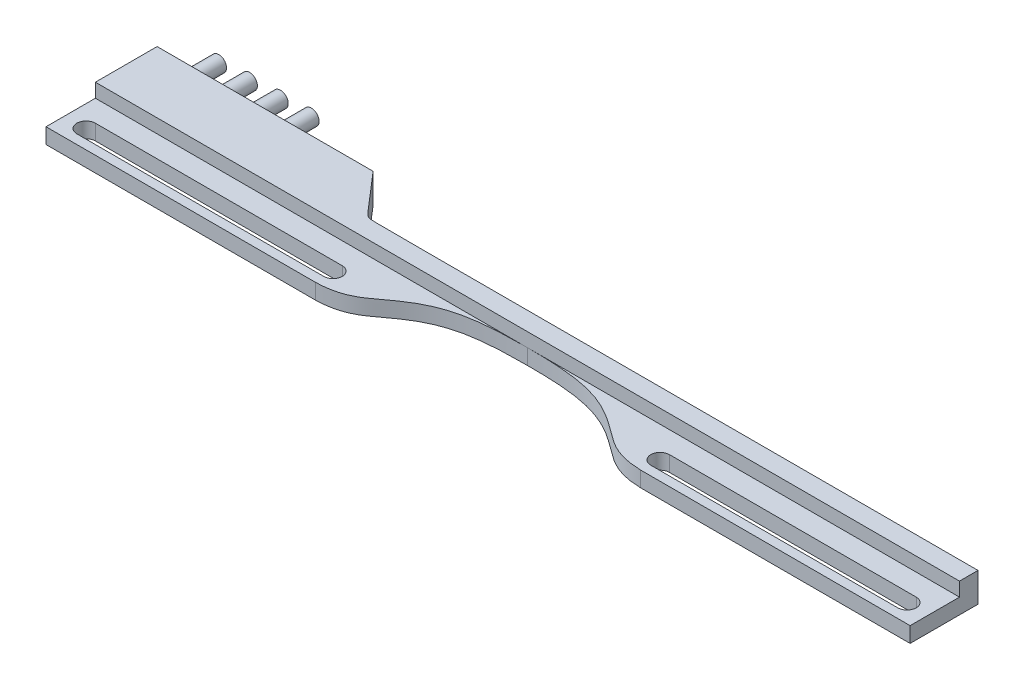
ISO-10303-21;
HEADER;
FILE_DESCRIPTION(('STEP AP214'),'2;1');
FILE_NAME('part.step','',(''),(''),'','','');
FILE_SCHEMA(('AUTOMOTIVE_DESIGN { 1 0 10303 214 1 1 1 1 }'));
ENDSEC;
DATA;
#1=APPLICATION_CONTEXT('core data for automotive mechanical design processes');
#2=APPLICATION_PROTOCOL_DEFINITION('international standard','automotive_design',2000,#1);
#3=PRODUCT_CONTEXT('',#1,'mechanical');
#4=PRODUCT('Part','Part','',(#3));
#5=PRODUCT_RELATED_PRODUCT_CATEGORY('part','',(#4));
#6=PRODUCT_DEFINITION_FORMATION('','',#4);
#7=PRODUCT_DEFINITION_CONTEXT('part definition',#1,'design');
#8=PRODUCT_DEFINITION('design','',#6,#7);
#9=PRODUCT_DEFINITION_SHAPE('','',#8);
#10=(LENGTH_UNIT() NAMED_UNIT(*) SI_UNIT(.MILLI.,.METRE.));
#11=(NAMED_UNIT(*) PLANE_ANGLE_UNIT() SI_UNIT($,.RADIAN.));
#12=(NAMED_UNIT(*) SI_UNIT($,.STERADIAN.) SOLID_ANGLE_UNIT());
#13=UNCERTAINTY_MEASURE_WITH_UNIT(LENGTH_MEASURE(1.E-05),#10,'distance_accuracy_value','');
#14=(GEOMETRIC_REPRESENTATION_CONTEXT(3) GLOBAL_UNCERTAINTY_ASSIGNED_CONTEXT((#13)) GLOBAL_UNIT_ASSIGNED_CONTEXT((#10,
#11,#12)) REPRESENTATION_CONTEXT('',''));
#15=CARTESIAN_POINT('',(0.,0.,0.));
#16=DIRECTION('',(0.,0.,1.));
#17=DIRECTION('',(1.,0.,0.));
#18=AXIS2_PLACEMENT_3D('',#15,#16,#17);
#19=CARTESIAN_POINT('',(0.,0.125,23.));
#20=DIRECTION('',(0.,0.,1.));
#21=DIRECTION('',(0.,-1.,0.));
#22=AXIS2_PLACEMENT_3D('',#19,#20,#21);
#23=PLANE('',#22);
#24=DIRECTION('',(0.,1.,0.));
#25=VECTOR('',#24,1.);
#26=CARTESIAN_POINT('',(96.3453863100341,-9.875,23.));
#27=LINE('',#26,#25);
#28=CARTESIAN_POINT('',(96.3453863100341,-2.375,23.));
#29=VERTEX_POINT('',#28);
#30=CARTESIAN_POINT('',(96.3453863100341,0.125,23.));
#31=VERTEX_POINT('',#30);
#32=EDGE_CURVE('E320',#29,#31,#27,.T.);
#33=ORIENTED_EDGE('',*,*,#32,.F.);
#34=DIRECTION('',(-1.,0.,0.));
#35=VECTOR('',#34,1.);
#36=CARTESIAN_POINT('',(0.,-2.375,23.));
#37=LINE('',#36,#35);
#38=CARTESIAN_POINT('',(140.,-2.375,23.));
#39=VERTEX_POINT('',#38);
#40=EDGE_CURVE('E334',#39,#29,#37,.T.);
#41=ORIENTED_EDGE('',*,*,#40,.F.);
#42=DIRECTION('',(0.,-1.,0.));
#43=VECTOR('',#42,1.);
#44=CARTESIAN_POINT('',(140.,0.125,23.));
#45=LINE('',#44,#43);
#46=CARTESIAN_POINT('',(140.,0.125,23.));
#47=VERTEX_POINT('',#46);
#48=EDGE_CURVE('E330',#47,#39,#45,.T.);
#49=ORIENTED_EDGE('',*,*,#48,.F.);
#50=DIRECTION('',(-1.,0.,0.));
#51=VECTOR('',#50,1.);
#52=CARTESIAN_POINT('',(0.,0.125,23.));
#53=LINE('',#52,#51);
#54=EDGE_CURVE('E326',#47,#31,#53,.T.);
#55=ORIENTED_EDGE('',*,*,#54,.T.);
#56=EDGE_LOOP('',(#33,#41,#49,#55));
#57=FACE_BOUND('',#56,.T.);
#58=ADVANCED_FACE('F40',(#57),#23,.T.);
#59=CARTESIAN_POINT('',(0.,0.125,0.));
#60=DIRECTION('',(0.,1.,0.));
#61=DIRECTION('',(0.,0.,1.));
#62=AXIS2_PLACEMENT_3D('',#59,#60,#61);
#63=PLANE('',#62);
#64=CARTESIAN_POINT('',(96.3453863100341,0.125,23.));
#65=CARTESIAN_POINT('',(92.5609012473441,0.125,22.9148010166718));
#66=CARTESIAN_POINT('',(89.9709060017118,0.125,21.1203137079236));
#67=CARTESIAN_POINT('',(83.2333905849735,0.125,16.0115335126528));
#68=CARTESIAN_POINT('',(78.6566735542121,0.125,14.9785837270284));
#69=CARTESIAN_POINT('',(70.,0.125,15.));
#70=B_SPLINE_CURVE_WITH_KNOTS('',3,(#64,#65,#66,#67,#68,#69),.UNSPECIFIED.,.F.,.F.,(4,1,1,4),
(0.,0.239896961919668,0.339896961919668,1.),.UNSPECIFIED.);
#71=CARTESIAN_POINT('',(70.5919468560306,0.125,14.9999999876382));
#72=VERTEX_POINT('',#71);
#73=EDGE_CURVE('E192',#31,#72,#70,.T.);
#74=ORIENTED_EDGE('',*,*,#73,.F.);
#75=ORIENTED_EDGE('',*,*,#54,.F.);
#76=DIRECTION('',(0.,0.,1.));
#77=VECTOR('',#76,1.);
#78=CARTESIAN_POINT('',(140.,0.125,15.));
#79=LINE('',#78,#77);
#80=CARTESIAN_POINT('',(140.,0.125,15.));
#81=VERTEX_POINT('',#80);
#82=EDGE_CURVE('E327',#81,#47,#79,.T.);
#83=ORIENTED_EDGE('',*,*,#82,.F.);
#84=DIRECTION('',(1.,0.,0.));
#85=VECTOR('',#84,1.);
#86=CARTESIAN_POINT('',(0.,0.125,15.));
#87=LINE('',#86,#85);
#88=EDGE_CURVE('E196',#72,#81,#87,.T.);
#89=ORIENTED_EDGE('',*,*,#88,.F.);
#90=EDGE_LOOP('',(#74,#75,#83,#89));
#91=FACE_BOUND('',#90,.T.);
#92=CARTESIAN_POINT('',(136.5,0.125000000000002,20.));
#93=DIRECTION('',(0.,1.,0.));
#94=DIRECTION('',(0.,0.,-1.));
#95=AXIS2_PLACEMENT_3D('',#92,#93,#94);
#96=CIRCLE('',#95,1.5);
#97=CARTESIAN_POINT('',(136.5,0.125000000000002,21.5));
#98=VERTEX_POINT('',#97);
#99=CARTESIAN_POINT('',(136.5,0.125,18.5));
#100=VERTEX_POINT('',#99);
#101=EDGE_CURVE('E486',#98,#100,#96,.T.);
#102=ORIENTED_EDGE('',*,*,#101,.F.);
#103=DIRECTION('',(1.,0.,0.));
#104=VECTOR('',#103,1.);
#105=CARTESIAN_POINT('',(136.5,0.125000000000002,21.5));
#106=LINE('',#105,#104);
#107=CARTESIAN_POINT('',(96.5,0.125000000000002,21.5));
#108=VERTEX_POINT('',#107);
#109=EDGE_CURVE('E524',#108,#98,#106,.T.);
#110=ORIENTED_EDGE('',*,*,#109,.F.);
#111=CARTESIAN_POINT('',(96.5,0.125000000000002,20.));
#112=DIRECTION('',(0.,1.,0.));
#113=DIRECTION('',(0.,0.,-1.));
#114=AXIS2_PLACEMENT_3D('',#111,#112,#113);
#115=CIRCLE('',#114,1.49999999999998);
#116=CARTESIAN_POINT('',(96.5,0.125000000000001,18.5));
#117=VERTEX_POINT('',#116);
#118=EDGE_CURVE('E538',#117,#108,#115,.T.);
#119=ORIENTED_EDGE('',*,*,#118,.F.);
#120=DIRECTION('',(-1.,0.,0.));
#121=VECTOR('',#120,1.);
#122=CARTESIAN_POINT('',(136.5,0.125000000000001,18.5));
#123=LINE('',#122,#121);
#124=EDGE_CURVE('E535',#100,#117,#123,.T.);
#125=ORIENTED_EDGE('',*,*,#124,.F.);
#126=EDGE_LOOP('',(#102,#110,#119,#125));
#127=FACE_BOUND('',#126,.T.);
#128=ADVANCED_FACE('F222',(#91,#127),#63,.T.);
#129=CARTESIAN_POINT('',(140.,2.375,15.));
#130=DIRECTION('',(0.,0.,-1.));
#131=DIRECTION('',(-1.,0.,0.));
#132=AXIS2_PLACEMENT_3D('',#129,#130,#131);
#133=PLANE('',#132);
#134=DIRECTION('',(0.,-1.,0.));
#135=VECTOR('',#134,1.);
#136=CARTESIAN_POINT('',(0.,2.375,15.));
#137=LINE('',#136,#135);
#138=CARTESIAN_POINT('',(0.,2.375,15.));
#139=VERTEX_POINT('',#138);
#140=CARTESIAN_POINT('',(0.,0.125,15.));
#141=VERTEX_POINT('',#140);
#142=EDGE_CURVE('E355',#139,#141,#137,.T.);
#143=ORIENTED_EDGE('',*,*,#142,.T.);
#144=CARTESIAN_POINT('',(69.4080531439843,0.125,15.));
#145=VERTEX_POINT('',#144);
#146=EDGE_CURVE('E48',#141,#145,#87,.T.);
#147=ORIENTED_EDGE('',*,*,#146,.T.);
#148=CARTESIAN_POINT('',(70.0000000000001,0.125,15.));
#149=CARTESIAN_POINT('',(69.8002113565528,0.124999999999998,14.9995057306831));
#150=CARTESIAN_POINT('',(69.6029166062134,0.124999999999997,14.9995006817098));
#151=CARTESIAN_POINT('',(69.4080531439686,0.124999999999997,14.9999999876382));
#152=B_SPLINE_CURVE_WITH_KNOTS('',3,(#148,#149,#150,#151),.UNSPECIFIED.,.F.,.F.,(4,4),(0.,
0.0152346152003534),.UNSPECIFIED.);
#153=CARTESIAN_POINT('',(70.0000000000001,0.125,15.));
#154=VERTEX_POINT('',#153);
#155=EDGE_CURVE('E61',#145,#154,#152,.F.);
#156=ORIENTED_EDGE('',*,*,#155,.T.);
#157=CARTESIAN_POINT('',(70.5919468560306,0.124999999999998,14.9999999876382));
#158=CARTESIAN_POINT('',(70.397083393786,0.124999999999998,14.9995006817098));
#159=CARTESIAN_POINT('',(70.1997886434469,0.124999999999998,14.9995057306831));
#160=CARTESIAN_POINT('',(70.,0.125,15.));
#161=B_SPLINE_CURVE_WITH_KNOTS('',3,(#157,#158,#159,#160),.UNSPECIFIED.,.F.,.F.,(4,4),
(0.98476538479967,1.),.UNSPECIFIED.);
#162=EDGE_CURVE('E186',#154,#72,#161,.F.);
#163=ORIENTED_EDGE('',*,*,#162,.T.);
#164=ORIENTED_EDGE('',*,*,#88,.T.);
#165=DIRECTION('',(0.,-1.,0.));
#166=VECTOR('',#165,1.);
#167=CARTESIAN_POINT('',(140.,2.375,15.));
#168=LINE('',#167,#166);
#169=CARTESIAN_POINT('',(140.,2.375,15.));
#170=VERTEX_POINT('',#169);
#171=EDGE_CURVE('E418',#170,#81,#168,.T.);
#172=ORIENTED_EDGE('',*,*,#171,.F.);
#173=DIRECTION('',(-1.,0.,0.));
#174=VECTOR('',#173,1.);
#175=CARTESIAN_POINT('',(140.,2.375,15.));
#176=LINE('',#175,#174);
#177=EDGE_CURVE('E424',#170,#139,#176,.T.);
#178=ORIENTED_EDGE('',*,*,#177,.T.);
#179=EDGE_LOOP('',(#143,#147,#156,#163,#164,#172,#178));
#180=FACE_BOUND('',#179,.T.);
#181=ADVANCED_FACE('F207',(#180),#133,.F.);
#182=CARTESIAN_POINT('',(140.,-2.375,15.));
#183=DIRECTION('',(0.,1.,0.));
#184=DIRECTION('',(0.,0.,1.));
#185=AXIS2_PLACEMENT_3D('',#182,#183,#184);
#186=PLANE('',#185);
#187=DIRECTION('',(-1.,0.,0.));
#188=VECTOR('',#187,1.);
#189=CARTESIAN_POINT('',(3.5,-2.375,18.5));
#190=LINE('',#189,#188);
#191=CARTESIAN_POINT('',(43.5,-2.375,18.5));
#192=VERTEX_POINT('',#191);
#193=CARTESIAN_POINT('',(3.5,-2.375,18.5));
#194=VERTEX_POINT('',#193);
#195=EDGE_CURVE('E497',#192,#194,#190,.T.);
#196=ORIENTED_EDGE('',*,*,#195,.T.);
#197=CARTESIAN_POINT('',(3.5,-2.375,20.));
#198=DIRECTION('',(0.,1.,0.));
#199=DIRECTION('',(0.,0.,1.));
#200=AXIS2_PLACEMENT_3D('',#197,#198,#199);
#201=CIRCLE('',#200,1.50000000000002);
#202=CARTESIAN_POINT('',(3.5,-2.375,21.5));
#203=VERTEX_POINT('',#202);
#204=EDGE_CURVE('E487',#194,#203,#201,.T.);
#205=ORIENTED_EDGE('',*,*,#204,.T.);
#206=DIRECTION('',(1.,0.,0.));
#207=VECTOR('',#206,1.);
#208=CARTESIAN_POINT('',(3.5,-2.375,21.5));
#209=LINE('',#208,#207);
#210=CARTESIAN_POINT('',(43.5,-2.375,21.5));
#211=VERTEX_POINT('',#210);
#212=EDGE_CURVE('E490',#203,#211,#209,.T.);
#213=ORIENTED_EDGE('',*,*,#212,.T.);
#214=CARTESIAN_POINT('',(43.5,-2.375,20.));
#215=DIRECTION('',(0.,1.,0.));
#216=DIRECTION('',(0.,0.,1.));
#217=AXIS2_PLACEMENT_3D('',#214,#215,#216);
#218=CIRCLE('',#217,1.5);
#219=EDGE_CURVE('E494',#211,#192,#218,.T.);
#220=ORIENTED_EDGE('',*,*,#219,.T.);
#221=EDGE_LOOP('',(#196,#205,#213,#220));
#222=FACE_BOUND('',#221,.T.);
#223=DIRECTION('',(1.,0.,0.));
#224=VECTOR('',#223,1.);
#225=CARTESIAN_POINT('',(136.5,-2.375,21.5));
#226=LINE('',#225,#224);
#227=CARTESIAN_POINT('',(96.5,-2.375,21.5));
#228=VERTEX_POINT('',#227);
#229=CARTESIAN_POINT('',(136.5,-2.375,21.5));
#230=VERTEX_POINT('',#229);
#231=EDGE_CURVE('E530',#228,#230,#226,.T.);
#232=ORIENTED_EDGE('',*,*,#231,.T.);
#233=CARTESIAN_POINT('',(136.5,-2.375,20.));
#234=DIRECTION('',(0.,1.,0.));
#235=DIRECTION('',(0.,0.,-1.));
#236=AXIS2_PLACEMENT_3D('',#233,#234,#235);
#237=CIRCLE('',#236,1.5);
#238=CARTESIAN_POINT('',(136.5,-2.375,18.5));
#239=VERTEX_POINT('',#238);
#240=EDGE_CURVE('E520',#230,#239,#237,.T.);
#241=ORIENTED_EDGE('',*,*,#240,.T.);
#242=DIRECTION('',(-1.,0.,0.));
#243=VECTOR('',#242,1.);
#244=CARTESIAN_POINT('',(136.5,-2.375,18.5));
#245=LINE('',#244,#243);
#246=CARTESIAN_POINT('',(96.5,-2.375,18.5));
#247=VERTEX_POINT('',#246);
#248=EDGE_CURVE('E523',#239,#247,#245,.T.);
#249=ORIENTED_EDGE('',*,*,#248,.T.);
#250=CARTESIAN_POINT('',(96.5,-2.375,20.));
#251=DIRECTION('',(0.,1.,0.));
#252=DIRECTION('',(0.,0.,-1.));
#253=AXIS2_PLACEMENT_3D('',#250,#251,#252);
#254=CIRCLE('',#253,1.49999999999998);
#255=EDGE_CURVE('E527',#247,#228,#254,.T.);
#256=ORIENTED_EDGE('',*,*,#255,.T.);
#257=EDGE_LOOP('',(#232,#241,#249,#256));
#258=FACE_BOUND('',#257,.T.);
#259=ORIENTED_EDGE('',*,*,#40,.T.);
#260=CARTESIAN_POINT('',(96.3453863100341,-2.375,23.));
#261=CARTESIAN_POINT('',(92.5609012473441,-2.375,22.9148010166718));
#262=CARTESIAN_POINT('',(89.9709060017118,-2.375,21.1203137079236));
#263=CARTESIAN_POINT('',(83.2333905849735,-2.375,16.0115335126528));
#264=CARTESIAN_POINT('',(78.6566735542121,-2.375,14.9785837270284));
#265=CARTESIAN_POINT('',(70.,-2.375,15.));
#266=B_SPLINE_CURVE_WITH_KNOTS('',3,(#260,#261,#262,#263,#264,#265),.UNSPECIFIED.,.F.,.F.,(4,1,
1,4),(0.,0.239896961919668,0.339896961919668,1.),.UNSPECIFIED.);
#267=CARTESIAN_POINT('',(70.0000000000001,-2.375,15.));
#268=VERTEX_POINT('',#267);
#269=EDGE_CURVE('E448',#29,#268,#266,.T.);
#270=ORIENTED_EDGE('',*,*,#269,.T.);
#271=CARTESIAN_POINT('',(70.0000000000001,-2.375,15.));
#272=CARTESIAN_POINT('',(61.343326445788,-2.375,14.9785837270284));
#273=CARTESIAN_POINT('',(56.7666094150265,-2.375,16.0115335126528));
#274=CARTESIAN_POINT('',(50.0290939982882,-2.375,21.1203137079236));
#275=CARTESIAN_POINT('',(47.4390987526559,-2.375,22.9148010166718));
#276=CARTESIAN_POINT('',(43.6546136899659,-2.375,23.));
#277=B_SPLINE_CURVE_WITH_KNOTS('',3,(#271,#272,#273,#274,#275,#276),.UNSPECIFIED.,.F.,.F.,(4,1,
1,4),(0.,0.660103038080332,0.760103038080332,1.),.UNSPECIFIED.);
#278=CARTESIAN_POINT('',(43.6546136899659,-2.375,23.));
#279=VERTEX_POINT('',#278);
#280=EDGE_CURVE('E201',#268,#279,#277,.T.);
#281=ORIENTED_EDGE('',*,*,#280,.T.);
#282=CARTESIAN_POINT('',(0.,-2.375,23.));
#283=VERTEX_POINT('',#282);
#284=EDGE_CURVE('E319',#279,#283,#37,.T.);
#285=ORIENTED_EDGE('',*,*,#284,.T.);
#286=DIRECTION('',(0.,0.,-1.));
#287=VECTOR('',#286,1.);
#288=CARTESIAN_POINT('',(0.,-2.375,15.));
#289=LINE('',#288,#287);
#290=CARTESIAN_POINT('',(-1.11022302462516E-13,-2.375,5.00000000000002));
#291=VERTEX_POINT('',#290);
#292=EDGE_CURVE('E357',#283,#291,#289,.T.);
#293=ORIENTED_EDGE('',*,*,#292,.T.);
#294=DIRECTION('',(1.,0.,0.));
#295=VECTOR('',#294,1.);
#296=CARTESIAN_POINT('',(140.,-2.375,5.00000000000002));
#297=LINE('',#296,#295);
#298=CARTESIAN_POINT('',(35.,-2.375,5.00000000000002));
#299=VERTEX_POINT('',#298);
#300=EDGE_CURVE('E343',#291,#299,#297,.T.);
#301=ORIENTED_EDGE('',*,*,#300,.T.);
#302=CARTESIAN_POINT('',(50.1986841535707,-2.375,12.));
#303=CARTESIAN_POINT('',(40.9873604241339,-2.375,12.));
#304=CARTESIAN_POINT('',(35.,-2.375,5.00000000000001));
#305=(BOUNDED_CURVE() B_SPLINE_CURVE(2,(#302,#303,#304),.UNSPECIFIED.,.F.,
.F.) B_SPLINE_CURVE_WITH_KNOTS((3,3),(0.,1.),
.UNSPECIFIED.) CURVE() GEOMETRIC_REPRESENTATION_ITEM() RATIONAL_B_SPLINE_CURVE((1.,
18.1659021245849,1.)) REPRESENTATION_ITEM(''));
#306=CARTESIAN_POINT('',(50.1986841535707,-2.375,12.));
#307=VERTEX_POINT('',#306);
#308=EDGE_CURVE('E54',#299,#307,#305,.F.);
#309=ORIENTED_EDGE('',*,*,#308,.T.);
#310=DIRECTION('',(1.,0.,0.));
#311=VECTOR('',#310,1.);
#312=CARTESIAN_POINT('',(140.,-2.375,12.));
#313=LINE('',#312,#311);
#314=CARTESIAN_POINT('',(140.,-2.375,12.));
#315=VERTEX_POINT('',#314);
#316=EDGE_CURVE('E354',#307,#315,#313,.T.);
#317=ORIENTED_EDGE('',*,*,#316,.T.);
#318=DIRECTION('',(0.,0.,-1.));
#319=VECTOR('',#318,1.);
#320=CARTESIAN_POINT('',(140.,-2.375,15.));
#321=LINE('',#320,#319);
#322=EDGE_CURVE('E421',#39,#315,#321,.T.);
#323=ORIENTED_EDGE('',*,*,#322,.F.);
#324=EDGE_LOOP('',(#259,#270,#281,#285,#293,#301,#309,#317,#323));
#325=FACE_BOUND('',#324,.T.);
#326=ADVANCED_FACE('F221',(#222,#258,#325),#186,.F.);
#327=CARTESIAN_POINT('',(140.,2.375,15.));
#328=DIRECTION('',(0.,-1.,0.));
#329=DIRECTION('',(0.,0.,-1.));
#330=AXIS2_PLACEMENT_3D('',#327,#328,#329);
#331=PLANE('',#330);
#332=DIRECTION('',(1.,0.,0.));
#333=VECTOR('',#332,1.);
#334=CARTESIAN_POINT('',(35.,2.375,12.));
#335=LINE('',#334,#333);
#336=CARTESIAN_POINT('',(50.1986841535707,2.375,12.));
#337=VERTEX_POINT('',#336);
#338=CARTESIAN_POINT('',(140.,2.375,12.));
#339=VERTEX_POINT('',#338);
#340=EDGE_CURVE('E349',#337,#339,#335,.T.);
#341=ORIENTED_EDGE('',*,*,#340,.F.);
#342=CARTESIAN_POINT('',(35.,2.375,5.00000000000001));
#343=CARTESIAN_POINT('',(40.9873604241339,2.375,12.));
#344=CARTESIAN_POINT('',(50.1986841535707,2.375,12.));
#345=(BOUNDED_CURVE() B_SPLINE_CURVE(2,(#342,#343,#344),.UNSPECIFIED.,.F.,
.F.) B_SPLINE_CURVE_WITH_KNOTS((3,3),(0.,1.),
.UNSPECIFIED.) CURVE() GEOMETRIC_REPRESENTATION_ITEM() RATIONAL_B_SPLINE_CURVE((1.,
18.1659021245849,1.)) REPRESENTATION_ITEM(''));
#346=CARTESIAN_POINT('',(35.,2.375,5.00000000000001));
#347=VERTEX_POINT('',#346);
#348=EDGE_CURVE('E276',#337,#347,#345,.F.);
#349=ORIENTED_EDGE('',*,*,#348,.T.);
#350=DIRECTION('',(1.,0.,0.));
#351=VECTOR('',#350,1.);
#352=CARTESIAN_POINT('',(188.959516425754,2.375,5.00000000000002));
#353=LINE('',#352,#351);
#354=CARTESIAN_POINT('',(-1.11022302462516E-13,2.375,5.00000000000002));
#355=VERTEX_POINT('',#354);
#356=EDGE_CURVE('E281',#355,#347,#353,.T.);
#357=ORIENTED_EDGE('',*,*,#356,.F.);
#358=DIRECTION('',(0.,0.,1.));
#359=VECTOR('',#358,1.);
#360=CARTESIAN_POINT('',(0.,2.375,15.));
#361=LINE('',#360,#359);
#362=EDGE_CURVE('E415',#355,#139,#361,.T.);
#363=ORIENTED_EDGE('',*,*,#362,.T.);
#364=ORIENTED_EDGE('',*,*,#177,.F.);
#365=DIRECTION('',(0.,0.,1.));
#366=VECTOR('',#365,1.);
#367=CARTESIAN_POINT('',(140.,2.375,15.));
#368=LINE('',#367,#366);
#369=EDGE_CURVE('E427',#339,#170,#368,.T.);
#370=ORIENTED_EDGE('',*,*,#369,.F.);
#371=EDGE_LOOP('',(#341,#349,#357,#363,#364,#370));
#372=FACE_BOUND('',#371,.T.);
#373=ADVANCED_FACE('F283',(#372),#331,.F.);
#374=CARTESIAN_POINT('',(140.,0.,0.));
#375=DIRECTION('',(1.,0.,0.));
#376=DIRECTION('',(0.,0.,-1.));
#377=AXIS2_PLACEMENT_3D('',#374,#375,#376);
#378=PLANE('',#377);
#379=DIRECTION('',(0.,-1.,0.));
#380=VECTOR('',#379,1.);
#381=CARTESIAN_POINT('',(140.,0.,12.));
#382=LINE('',#381,#380);
#383=EDGE_CURVE('E426',#339,#315,#382,.T.);
#384=ORIENTED_EDGE('',*,*,#383,.F.);
#385=ORIENTED_EDGE('',*,*,#369,.T.);
#386=ORIENTED_EDGE('',*,*,#171,.T.);
#387=ORIENTED_EDGE('',*,*,#82,.T.);
#388=ORIENTED_EDGE('',*,*,#48,.T.);
#389=ORIENTED_EDGE('',*,*,#322,.T.);
#390=EDGE_LOOP('',(#384,#385,#386,#387,#388,#389));
#391=FACE_BOUND('',#390,.T.);
#392=ADVANCED_FACE('F258',(#391),#378,.T.);
#393=CARTESIAN_POINT('',(0.,0.,0.));
#394=DIRECTION('',(1.,0.,0.));
#395=DIRECTION('',(0.,0.,-1.));
#396=AXIS2_PLACEMENT_3D('',#393,#394,#395);
#397=PLANE('',#396);
#398=ORIENTED_EDGE('',*,*,#362,.F.);
#399=DIRECTION('',(0.,1.,0.));
#400=VECTOR('',#399,1.);
#401=CARTESIAN_POINT('',(-1.11022302462516E-13,-7.625,5.00000000000002));
#402=LINE('',#401,#400);
#403=EDGE_CURVE('E341',#291,#355,#402,.T.);
#404=ORIENTED_EDGE('',*,*,#403,.F.);
#405=ORIENTED_EDGE('',*,*,#292,.F.);
#406=DIRECTION('',(0.,-1.,0.));
#407=VECTOR('',#406,1.);
#408=CARTESIAN_POINT('',(0.,0.125,23.));
#409=LINE('',#408,#407);
#410=CARTESIAN_POINT('',(0.,0.125,23.));
#411=VERTEX_POINT('',#410);
#412=EDGE_CURVE('E337',#411,#283,#409,.T.);
#413=ORIENTED_EDGE('',*,*,#412,.F.);
#414=DIRECTION('',(0.,0.,-1.));
#415=VECTOR('',#414,1.);
#416=CARTESIAN_POINT('',(0.,0.125,15.));
#417=LINE('',#416,#415);
#418=EDGE_CURVE('E325',#411,#141,#417,.T.);
#419=ORIENTED_EDGE('',*,*,#418,.T.);
#420=ORIENTED_EDGE('',*,*,#142,.F.);
#421=EDGE_LOOP('',(#398,#404,#405,#413,#419,#420));
#422=FACE_BOUND('',#421,.T.);
#423=ADVANCED_FACE('F256',(#422),#397,.F.);
#424=CARTESIAN_POINT('',(35.,-27.625,12.));
#425=DIRECTION('',(0.,0.,1.));
#426=DIRECTION('',(1.,0.,0.));
#427=AXIS2_PLACEMENT_3D('',#424,#425,#426);
#428=PLANE('',#427);
#429=ORIENTED_EDGE('',*,*,#316,.F.);
#430=CARTESIAN_POINT('',(50.1986841535707,2.6125,12.));
#431=CARTESIAN_POINT('',(50.1986841535707,0.870833333333334,12.));
#432=CARTESIAN_POINT('',(50.1986841535707,-0.870833333333334,12.));
#433=CARTESIAN_POINT('',(50.1986841535707,-2.6125,12.));
#434=(BOUNDED_CURVE() B_SPLINE_CURVE(3,(#430,#431,#432,#433),.UNSPECIFIED.,.F.,
.F.) B_SPLINE_CURVE_WITH_KNOTS((4,4),(-0.0302375,-0.0250125),
.UNSPECIFIED.) CURVE() GEOMETRIC_REPRESENTATION_ITEM() RATIONAL_B_SPLINE_CURVE((1.,1.,1.,1.)) REPRESENTATION_ITEM(''));
#435=EDGE_CURVE('E391',#307,#337,#434,.F.);
#436=ORIENTED_EDGE('',*,*,#435,.T.);
#437=ORIENTED_EDGE('',*,*,#340,.T.);
#438=ORIENTED_EDGE('',*,*,#383,.T.);
#439=EDGE_LOOP('',(#429,#436,#437,#438));
#440=FACE_BOUND('',#439,.T.);
#441=ADVANCED_FACE('F250',(#440),#428,.F.);
#442=CARTESIAN_POINT('',(188.959516425754,-7.625,5.00000000000002));
#443=DIRECTION('',(0.,0.,1.));
#444=DIRECTION('',(0.,-1.,0.));
#445=AXIS2_PLACEMENT_3D('',#442,#443,#444);
#446=PLANE('',#445);
#447=CARTESIAN_POINT('',(20.,0.,5.00000000000002));
#448=DIRECTION('',(0.,0.,1.));
#449=DIRECTION('',(0.,-1.,0.));
#450=AXIS2_PLACEMENT_3D('',#447,#448,#449);
#451=CIRCLE('',#450,1.25);
#452=CARTESIAN_POINT('',(20.,-1.25,5.00000000000002));
#453=VERTEX_POINT('',#452);
#454=EDGE_CURVE('E352',#453,#453,#451,.F.);
#455=ORIENTED_EDGE('',*,*,#454,.F.);
#456=EDGE_LOOP('',(#455));
#457=FACE_BOUND('',#456,.T.);
#458=CARTESIAN_POINT('',(15.,0.,5.00000000000002));
#459=DIRECTION('',(0.,0.,1.));
#460=DIRECTION('',(0.,-1.,0.));
#461=AXIS2_PLACEMENT_3D('',#458,#459,#460);
#462=CIRCLE('',#461,1.25);
#463=CARTESIAN_POINT('',(15.,-1.25,5.00000000000002));
#464=VERTEX_POINT('',#463);
#465=EDGE_CURVE('E434',#464,#464,#462,.F.);
#466=ORIENTED_EDGE('',*,*,#465,.F.);
#467=EDGE_LOOP('',(#466));
#468=FACE_BOUND('',#467,.T.);
#469=CARTESIAN_POINT('',(10.,0.,5.00000000000002));
#470=DIRECTION('',(0.,0.,1.));
#471=DIRECTION('',(0.,-1.,0.));
#472=AXIS2_PLACEMENT_3D('',#469,#470,#471);
#473=CIRCLE('',#472,1.25);
#474=CARTESIAN_POINT('',(10.,-1.25,5.00000000000002));
#475=VERTEX_POINT('',#474);
#476=EDGE_CURVE('E432',#475,#475,#473,.F.);
#477=ORIENTED_EDGE('',*,*,#476,.F.);
#478=EDGE_LOOP('',(#477));
#479=FACE_BOUND('',#478,.T.);
#480=CARTESIAN_POINT('',(5.,0.,5.00000000000002));
#481=DIRECTION('',(0.,0.,1.));
#482=DIRECTION('',(0.,-1.,0.));
#483=AXIS2_PLACEMENT_3D('',#480,#481,#482);
#484=CIRCLE('',#483,1.25);
#485=CARTESIAN_POINT('',(5.,-1.25,5.00000000000002));
#486=VERTEX_POINT('',#485);
#487=EDGE_CURVE('E429',#486,#486,#484,.F.);
#488=ORIENTED_EDGE('',*,*,#487,.F.);
#489=EDGE_LOOP('',(#488));
#490=FACE_BOUND('',#489,.T.);
#491=ORIENTED_EDGE('',*,*,#403,.T.);
#492=ORIENTED_EDGE('',*,*,#356,.T.);
#493=CARTESIAN_POINT('',(35.,-2.6125,5.00000000000001));
#494=CARTESIAN_POINT('',(35.,-0.870833333333333,5.00000000000001));
#495=CARTESIAN_POINT('',(35.,0.870833333333333,5.00000000000001));
#496=CARTESIAN_POINT('',(35.,2.6125,5.00000000000001));
#497=(BOUNDED_CURVE() B_SPLINE_CURVE(3,(#493,#494,#495,#496),.UNSPECIFIED.,.F.,
.F.) B_SPLINE_CURVE_WITH_KNOTS((4,4),(-0.0302375,-0.0250125),
.UNSPECIFIED.) CURVE() GEOMETRIC_REPRESENTATION_ITEM() RATIONAL_B_SPLINE_CURVE((1.,1.,1.,1.)) REPRESENTATION_ITEM(''));
#498=EDGE_CURVE('E351',#299,#347,#497,.T.);
#499=ORIENTED_EDGE('',*,*,#498,.F.);
#500=ORIENTED_EDGE('',*,*,#300,.F.);
#501=EDGE_LOOP('',(#491,#492,#499,#500));
#502=FACE_BOUND('',#501,.T.);
#503=ADVANCED_FACE('F239',(#457,#468,#479,#490,#502),#446,.F.);
#504=DIRECTION('',(0.,1.,0.));
#505=VECTOR('',#504,1.);
#506=CARTESIAN_POINT('',(43.6546136899659,-9.875,23.));
#507=LINE('',#506,#505);
#508=CARTESIAN_POINT('',(43.6546136899659,0.125,23.));
#509=VERTEX_POINT('',#508);
#510=EDGE_CURVE('E202',#279,#509,#507,.T.);
#511=ORIENTED_EDGE('',*,*,#510,.T.);
#512=EDGE_CURVE('E317',#509,#411,#53,.T.);
#513=ORIENTED_EDGE('',*,*,#512,.T.);
#514=ORIENTED_EDGE('',*,*,#412,.T.);
#515=ORIENTED_EDGE('',*,*,#284,.F.);
#516=EDGE_LOOP('',(#511,#513,#514,#515));
#517=FACE_BOUND('',#516,.T.);
#518=ADVANCED_FACE('F249',(#517),#23,.T.);
#519=CARTESIAN_POINT('',(70.0000000000001,0.124999999999998,15.));
#520=CARTESIAN_POINT('',(61.343326445788,0.124999999999998,14.9785837270284));
#521=CARTESIAN_POINT('',(56.7666094150265,0.124999999999998,16.0115335126528));
#522=CARTESIAN_POINT('',(50.0290939982882,0.124999999999998,21.1203137079236));
#523=CARTESIAN_POINT('',(47.4390987526559,0.124999999999998,22.9148010166718));
#524=CARTESIAN_POINT('',(43.6546136899659,0.124999999999998,23.));
#525=B_SPLINE_CURVE_WITH_KNOTS('',3,(#519,#520,#521,#522,#523,#524),.UNSPECIFIED.,.F.,.F.,(4,1,
1,4),(0.,0.660103038080332,0.760103038080332,1.),.UNSPECIFIED.);
#526=EDGE_CURVE('E12',#145,#509,#525,.T.);
#527=ORIENTED_EDGE('',*,*,#526,.F.);
#528=ORIENTED_EDGE('',*,*,#146,.F.);
#529=ORIENTED_EDGE('',*,*,#418,.F.);
#530=ORIENTED_EDGE('',*,*,#512,.F.);
#531=EDGE_LOOP('',(#527,#528,#529,#530));
#532=FACE_BOUND('',#531,.T.);
#533=CARTESIAN_POINT('',(3.5,0.125000000000002,20.));
#534=DIRECTION('',(0.,1.,0.));
#535=DIRECTION('',(0.,0.,1.));
#536=AXIS2_PLACEMENT_3D('',#533,#534,#535);
#537=CIRCLE('',#536,1.50000000000002);
#538=CARTESIAN_POINT('',(3.5,0.125000000000001,18.5));
#539=VERTEX_POINT('',#538);
#540=CARTESIAN_POINT('',(3.5,0.125,21.5));
#541=VERTEX_POINT('',#540);
#542=EDGE_CURVE('E501',#539,#541,#537,.T.);
#543=ORIENTED_EDGE('',*,*,#542,.F.);
#544=DIRECTION('',(-1.,0.,0.));
#545=VECTOR('',#544,1.);
#546=CARTESIAN_POINT('',(3.5,0.125000000000001,18.5));
#547=LINE('',#546,#545);
#548=CARTESIAN_POINT('',(43.5,0.125000000000001,18.5));
#549=VERTEX_POINT('',#548);
#550=EDGE_CURVE('E491',#549,#539,#547,.T.);
#551=ORIENTED_EDGE('',*,*,#550,.F.);
#552=CARTESIAN_POINT('',(43.5,0.125000000000002,20.));
#553=DIRECTION('',(0.,1.,0.));
#554=DIRECTION('',(0.,0.,1.));
#555=AXIS2_PLACEMENT_3D('',#552,#553,#554);
#556=CIRCLE('',#555,1.5);
#557=CARTESIAN_POINT('',(43.5,0.125000000000002,21.5));
#558=VERTEX_POINT('',#557);
#559=EDGE_CURVE('E507',#558,#549,#556,.T.);
#560=ORIENTED_EDGE('',*,*,#559,.F.);
#561=DIRECTION('',(1.,0.,0.));
#562=VECTOR('',#561,1.);
#563=CARTESIAN_POINT('',(3.5,0.125000000000002,21.5));
#564=LINE('',#563,#562);
#565=EDGE_CURVE('E503',#541,#558,#564,.T.);
#566=ORIENTED_EDGE('',*,*,#565,.F.);
#567=EDGE_LOOP('',(#543,#551,#560,#566));
#568=FACE_BOUND('',#567,.T.);
#569=ADVANCED_FACE('F304',(#532,#568),#63,.T.);
#570=CARTESIAN_POINT('',(136.5,-2.375,20.));
#571=DIRECTION('',(0.,1.,0.));
#572=DIRECTION('',(0.,0.,1.));
#573=AXIS2_PLACEMENT_3D('',#570,#571,#572);
#574=CYLINDRICAL_SURFACE('',#573,1.5);
#575=ORIENTED_EDGE('',*,*,#101,.T.);
#576=DIRECTION('',(0.,1.,0.));
#577=VECTOR('',#576,1.);
#578=CARTESIAN_POINT('',(136.5,-2.375,18.5));
#579=LINE('',#578,#577);
#580=EDGE_CURVE('E533',#239,#100,#579,.T.);
#581=ORIENTED_EDGE('',*,*,#580,.F.);
#582=ORIENTED_EDGE('',*,*,#240,.F.);
#583=DIRECTION('',(0.,1.,0.));
#584=VECTOR('',#583,1.);
#585=CARTESIAN_POINT('',(136.5,-2.375,21.5));
#586=LINE('',#585,#584);
#587=EDGE_CURVE('E504',#230,#98,#586,.T.);
#588=ORIENTED_EDGE('',*,*,#587,.T.);
#589=EDGE_LOOP('',(#575,#581,#582,#588));
#590=FACE_BOUND('',#589,.T.);
#591=ADVANCED_FACE('F311',(#590),#574,.F.);
#592=CARTESIAN_POINT('',(136.5,-2.375,21.5));
#593=DIRECTION('',(0.,0.,1.));
#594=DIRECTION('',(1.,0.,0.));
#595=AXIS2_PLACEMENT_3D('',#592,#593,#594);
#596=PLANE('',#595);
#597=ORIENTED_EDGE('',*,*,#109,.T.);
#598=ORIENTED_EDGE('',*,*,#587,.F.);
#599=ORIENTED_EDGE('',*,*,#231,.F.);
#600=DIRECTION('',(0.,1.,0.));
#601=VECTOR('',#600,1.);
#602=CARTESIAN_POINT('',(96.5,-2.375,21.5));
#603=LINE('',#602,#601);
#604=EDGE_CURVE('E544',#228,#108,#603,.T.);
#605=ORIENTED_EDGE('',*,*,#604,.T.);
#606=EDGE_LOOP('',(#597,#598,#599,#605));
#607=FACE_BOUND('',#606,.T.);
#608=ADVANCED_FACE('F567',(#607),#596,.F.);
#609=CARTESIAN_POINT('',(96.5,-2.375,20.));
#610=DIRECTION('',(0.,1.,0.));
#611=DIRECTION('',(0.,0.,1.));
#612=AXIS2_PLACEMENT_3D('',#609,#610,#611);
#613=CYLINDRICAL_SURFACE('',#612,1.49999999999998);
#614=ORIENTED_EDGE('',*,*,#118,.T.);
#615=ORIENTED_EDGE('',*,*,#604,.F.);
#616=ORIENTED_EDGE('',*,*,#255,.F.);
#617=DIRECTION('',(0.,1.,0.));
#618=VECTOR('',#617,1.);
#619=CARTESIAN_POINT('',(96.5,-2.375,18.5));
#620=LINE('',#619,#618);
#621=EDGE_CURVE('E546',#247,#117,#620,.T.);
#622=ORIENTED_EDGE('',*,*,#621,.T.);
#623=EDGE_LOOP('',(#614,#615,#616,#622));
#624=FACE_BOUND('',#623,.T.);
#625=ADVANCED_FACE('F569',(#624),#613,.F.);
#626=CARTESIAN_POINT('',(136.5,-2.375,18.5));
#627=DIRECTION('',(0.,0.,-1.));
#628=DIRECTION('',(-1.,0.,0.));
#629=AXIS2_PLACEMENT_3D('',#626,#627,#628);
#630=PLANE('',#629);
#631=ORIENTED_EDGE('',*,*,#124,.T.);
#632=ORIENTED_EDGE('',*,*,#621,.F.);
#633=ORIENTED_EDGE('',*,*,#248,.F.);
#634=ORIENTED_EDGE('',*,*,#580,.T.);
#635=EDGE_LOOP('',(#631,#632,#633,#634));
#636=FACE_BOUND('',#635,.T.);
#637=ADVANCED_FACE('F562',(#636),#630,.F.);
#638=CARTESIAN_POINT('',(3.5,-2.375,20.));
#639=DIRECTION('',(0.,1.,0.));
#640=DIRECTION('',(0.,0.,1.));
#641=AXIS2_PLACEMENT_3D('',#638,#639,#640);
#642=CYLINDRICAL_SURFACE('',#641,1.50000000000002);
#643=ORIENTED_EDGE('',*,*,#542,.T.);
#644=DIRECTION('',(0.,1.,0.));
#645=VECTOR('',#644,1.);
#646=CARTESIAN_POINT('',(3.5,-2.375,21.5));
#647=LINE('',#646,#645);
#648=EDGE_CURVE('E500',#203,#541,#647,.T.);
#649=ORIENTED_EDGE('',*,*,#648,.F.);
#650=ORIENTED_EDGE('',*,*,#204,.F.);
#651=DIRECTION('',(0.,1.,0.));
#652=VECTOR('',#651,1.);
#653=CARTESIAN_POINT('',(3.5,-2.375,18.5));
#654=LINE('',#653,#652);
#655=EDGE_CURVE('E512',#194,#539,#654,.T.);
#656=ORIENTED_EDGE('',*,*,#655,.T.);
#657=EDGE_LOOP('',(#643,#649,#650,#656));
#658=FACE_BOUND('',#657,.T.);
#659=ADVANCED_FACE('F576',(#658),#642,.F.);
#660=CARTESIAN_POINT('',(3.5,-2.375,18.5));
#661=DIRECTION('',(0.,0.,-1.));
#662=DIRECTION('',(-1.,0.,0.));
#663=AXIS2_PLACEMENT_3D('',#660,#661,#662);
#664=PLANE('',#663);
#665=ORIENTED_EDGE('',*,*,#550,.T.);
#666=ORIENTED_EDGE('',*,*,#655,.F.);
#667=ORIENTED_EDGE('',*,*,#195,.F.);
#668=DIRECTION('',(0.,1.,0.));
#669=VECTOR('',#668,1.);
#670=CARTESIAN_POINT('',(43.5,-2.375,18.5));
#671=LINE('',#670,#669);
#672=EDGE_CURVE('E514',#192,#549,#671,.T.);
#673=ORIENTED_EDGE('',*,*,#672,.T.);
#674=EDGE_LOOP('',(#665,#666,#667,#673));
#675=FACE_BOUND('',#674,.T.);
#676=ADVANCED_FACE('F609',(#675),#664,.F.);
#677=CARTESIAN_POINT('',(43.5,-2.375,20.));
#678=DIRECTION('',(0.,1.,0.));
#679=DIRECTION('',(0.,0.,1.));
#680=AXIS2_PLACEMENT_3D('',#677,#678,#679);
#681=CYLINDRICAL_SURFACE('',#680,1.5);
#682=ORIENTED_EDGE('',*,*,#559,.T.);
#683=ORIENTED_EDGE('',*,*,#672,.F.);
#684=ORIENTED_EDGE('',*,*,#219,.F.);
#685=DIRECTION('',(0.,1.,0.));
#686=VECTOR('',#685,1.);
#687=CARTESIAN_POINT('',(43.5,-2.375,21.5));
#688=LINE('',#687,#686);
#689=EDGE_CURVE('E516',#211,#558,#688,.T.);
#690=ORIENTED_EDGE('',*,*,#689,.T.);
#691=EDGE_LOOP('',(#682,#683,#684,#690));
#692=FACE_BOUND('',#691,.T.);
#693=ADVANCED_FACE('F618',(#692),#681,.F.);
#694=CARTESIAN_POINT('',(3.5,-2.375,21.5));
#695=DIRECTION('',(0.,0.,1.));
#696=DIRECTION('',(1.,0.,0.));
#697=AXIS2_PLACEMENT_3D('',#694,#695,#696);
#698=PLANE('',#697);
#699=ORIENTED_EDGE('',*,*,#565,.T.);
#700=ORIENTED_EDGE('',*,*,#689,.F.);
#701=ORIENTED_EDGE('',*,*,#212,.F.);
#702=ORIENTED_EDGE('',*,*,#648,.T.);
#703=EDGE_LOOP('',(#699,#700,#701,#702));
#704=FACE_BOUND('',#703,.T.);
#705=ADVANCED_FACE('F628',(#704),#698,.F.);
#706=CARTESIAN_POINT('',(5.,0.,0.));
#707=DIRECTION('',(0.,0.,1.));
#708=DIRECTION('',(0.,-1.,0.));
#709=AXIS2_PLACEMENT_3D('',#706,#707,#708);
#710=CYLINDRICAL_SURFACE('',#709,1.25);
#711=CARTESIAN_POINT('',(5.,0.,0.));
#712=DIRECTION('',(0.,0.,-1.));
#713=DIRECTION('',(0.,1.,0.));
#714=AXIS2_PLACEMENT_3D('',#711,#712,#713);
#715=CIRCLE('',#714,1.25);
#716=CARTESIAN_POINT('',(5.,1.25,0.));
#717=VERTEX_POINT('',#716);
#718=EDGE_CURVE('E483',#717,#717,#715,.T.);
#719=ORIENTED_EDGE('',*,*,#718,.F.);
#720=EDGE_LOOP('',(#719));
#721=FACE_BOUND('',#720,.T.);
#722=ORIENTED_EDGE('',*,*,#487,.T.);
#723=EDGE_LOOP('',(#722));
#724=FACE_BOUND('',#723,.T.);
#725=ADVANCED_FACE('F638',(#721,#724),#710,.T.);
#726=CARTESIAN_POINT('',(5.,0.,0.));
#727=DIRECTION('',(0.,0.,-1.));
#728=DIRECTION('',(0.,1.,0.));
#729=AXIS2_PLACEMENT_3D('',#726,#727,#728);
#730=PLANE('',#729);
#731=ORIENTED_EDGE('',*,*,#718,.T.);
#732=EDGE_LOOP('',(#731));
#733=FACE_BOUND('',#732,.T.);
#734=ADVANCED_FACE('F648',(#733),#730,.T.);
#735=CARTESIAN_POINT('',(10.,0.,0.));
#736=DIRECTION('',(0.,0.,1.));
#737=DIRECTION('',(0.,-1.,0.));
#738=AXIS2_PLACEMENT_3D('',#735,#736,#737);
#739=CYLINDRICAL_SURFACE('',#738,1.25);
#740=CARTESIAN_POINT('',(10.,0.,0.));
#741=DIRECTION('',(0.,0.,-1.));
#742=DIRECTION('',(0.,1.,0.));
#743=AXIS2_PLACEMENT_3D('',#740,#741,#742);
#744=CIRCLE('',#743,1.25);
#745=CARTESIAN_POINT('',(10.,1.25,0.));
#746=VERTEX_POINT('',#745);
#747=EDGE_CURVE('E474',#746,#746,#744,.T.);
#748=ORIENTED_EDGE('',*,*,#747,.F.);
#749=EDGE_LOOP('',(#748));
#750=FACE_BOUND('',#749,.T.);
#751=ORIENTED_EDGE('',*,*,#476,.T.);
#752=EDGE_LOOP('',(#751));
#753=FACE_BOUND('',#752,.T.);
#754=ADVANCED_FACE('F658',(#750,#753),#739,.T.);
#755=CARTESIAN_POINT('',(10.,0.,0.));
#756=DIRECTION('',(0.,0.,-1.));
#757=DIRECTION('',(0.,1.,0.));
#758=AXIS2_PLACEMENT_3D('',#755,#756,#757);
#759=PLANE('',#758);
#760=ORIENTED_EDGE('',*,*,#747,.T.);
#761=EDGE_LOOP('',(#760));
#762=FACE_BOUND('',#761,.T.);
#763=ADVANCED_FACE('F668',(#762),#759,.T.);
#764=CARTESIAN_POINT('',(15.,0.,0.));
#765=DIRECTION('',(0.,0.,1.));
#766=DIRECTION('',(0.,-1.,0.));
#767=AXIS2_PLACEMENT_3D('',#764,#765,#766);
#768=CYLINDRICAL_SURFACE('',#767,1.25);
#769=CARTESIAN_POINT('',(15.,0.,0.));
#770=DIRECTION('',(0.,0.,-1.));
#771=DIRECTION('',(0.,1.,0.));
#772=AXIS2_PLACEMENT_3D('',#769,#770,#771);
#773=CIRCLE('',#772,1.25);
#774=CARTESIAN_POINT('',(15.,1.25,0.));
#775=VERTEX_POINT('',#774);
#776=EDGE_CURVE('E469',#775,#775,#773,.T.);
#777=ORIENTED_EDGE('',*,*,#776,.F.);
#778=EDGE_LOOP('',(#777));
#779=FACE_BOUND('',#778,.T.);
#780=ORIENTED_EDGE('',*,*,#465,.T.);
#781=EDGE_LOOP('',(#780));
#782=FACE_BOUND('',#781,.T.);
#783=ADVANCED_FACE('F678',(#779,#782),#768,.T.);
#784=CARTESIAN_POINT('',(15.,0.,0.));
#785=DIRECTION('',(0.,0.,-1.));
#786=DIRECTION('',(0.,1.,0.));
#787=AXIS2_PLACEMENT_3D('',#784,#785,#786);
#788=PLANE('',#787);
#789=ORIENTED_EDGE('',*,*,#776,.T.);
#790=EDGE_LOOP('',(#789));
#791=FACE_BOUND('',#790,.T.);
#792=ADVANCED_FACE('F688',(#791),#788,.T.);
#793=CARTESIAN_POINT('',(20.,0.,0.));
#794=DIRECTION('',(0.,0.,1.));
#795=DIRECTION('',(0.,-1.,0.));
#796=AXIS2_PLACEMENT_3D('',#793,#794,#795);
#797=CYLINDRICAL_SURFACE('',#796,1.25);
#798=CARTESIAN_POINT('',(20.,0.,0.));
#799=DIRECTION('',(0.,0.,-1.));
#800=DIRECTION('',(0.,1.,0.));
#801=AXIS2_PLACEMENT_3D('',#798,#799,#800);
#802=CIRCLE('',#801,1.25);
#803=CARTESIAN_POINT('',(20.,1.25,0.));
#804=VERTEX_POINT('',#803);
#805=EDGE_CURVE('E464',#804,#804,#802,.T.);
#806=ORIENTED_EDGE('',*,*,#805,.F.);
#807=EDGE_LOOP('',(#806));
#808=FACE_BOUND('',#807,.T.);
#809=ORIENTED_EDGE('',*,*,#454,.T.);
#810=EDGE_LOOP('',(#809));
#811=FACE_BOUND('',#810,.T.);
#812=ADVANCED_FACE('F698',(#808,#811),#797,.T.);
#813=CARTESIAN_POINT('',(20.,0.,0.));
#814=DIRECTION('',(0.,0.,-1.));
#815=DIRECTION('',(0.,1.,0.));
#816=AXIS2_PLACEMENT_3D('',#813,#814,#815);
#817=PLANE('',#816);
#818=ORIENTED_EDGE('',*,*,#805,.T.);
#819=EDGE_LOOP('',(#818));
#820=FACE_BOUND('',#819,.T.);
#821=ADVANCED_FACE('F708',(#820),#817,.T.);
#822=CARTESIAN_POINT('',(35.,2.6125,5.00000000000001));
#823=CARTESIAN_POINT('',(35.,0.870833333333334,5.00000000000001));
#824=CARTESIAN_POINT('',(35.,-0.870833333333334,5.00000000000001));
#825=CARTESIAN_POINT('',(35.,-2.6125,5.00000000000001));
#826=CARTESIAN_POINT('',(40.9873604241339,2.6125,12.));
#827=CARTESIAN_POINT('',(40.9873604241339,0.870833333333334,12.));
#828=CARTESIAN_POINT('',(40.9873604241339,-0.870833333333334,12.));
#829=CARTESIAN_POINT('',(40.9873604241339,-2.6125,12.));
#830=CARTESIAN_POINT('',(50.1986841535707,2.6125,12.));
#831=CARTESIAN_POINT('',(50.1986841535707,0.870833333333334,12.));
#832=CARTESIAN_POINT('',(50.1986841535707,-0.870833333333334,12.));
#833=CARTESIAN_POINT('',(50.1986841535707,-2.6125,12.));
#834=(BOUNDED_SURFACE() B_SPLINE_SURFACE(2,3,((#822,#823,#824,#825),(#826,#827,#828,#829),(#830,
#831,#832,#833)),.UNSPECIFIED.,.F.,.F.,.F.) B_SPLINE_SURFACE_WITH_KNOTS((3,3),(4,4),(0.,1.),
(-0.0302375,-0.0250125),
.UNSPECIFIED.) GEOMETRIC_REPRESENTATION_ITEM() RATIONAL_B_SPLINE_SURFACE(((1.,1.,1.,1.),
(18.1659021245849,18.1659021245849,18.1659021245849,18.1659021245849),(1.,1.,1.,1.))) REPRESENTATION_ITEM('') SURFACE());
#835=ORIENTED_EDGE('',*,*,#308,.F.);
#836=ORIENTED_EDGE('',*,*,#498,.T.);
#837=ORIENTED_EDGE('',*,*,#348,.F.);
#838=ORIENTED_EDGE('',*,*,#435,.F.);
#839=EDGE_LOOP('',(#835,#836,#837,#838));
#840=FACE_BOUND('',#839,.T.);
#841=ADVANCED_FACE('F43',(#840),#834,.T.);
#842=CARTESIAN_POINT('',(96.3453863100341,-9.875,23.));
#843=CARTESIAN_POINT('',(92.5609012473441,-9.875,22.9148010166718));
#844=CARTESIAN_POINT('',(89.9709060017118,-9.875,21.1203137079236));
#845=CARTESIAN_POINT('',(83.2333905849735,-9.875,16.0115335126528));
#846=CARTESIAN_POINT('',(78.6566735542121,-9.875,14.9785837270284));
#847=CARTESIAN_POINT('',(70.,-9.875,15.));
#848=B_SPLINE_CURVE_WITH_KNOTS('',3,(#842,#843,#844,#845,#846,#847),.UNSPECIFIED.,.F.,.F.,(4,1,
1,4),(0.,0.239896961919668,0.339896961919668,1.),.UNSPECIFIED.);
#849=DIRECTION('',(0.,1.,0.));
#850=VECTOR('',#849,1.);
#851=SURFACE_OF_LINEAR_EXTRUSION('',#848,#850);
#852=ORIENTED_EDGE('',*,*,#32,.T.);
#853=ORIENTED_EDGE('',*,*,#73,.T.);
#854=ORIENTED_EDGE('',*,*,#162,.F.);
#855=DIRECTION('',(0.,1.,0.));
#856=VECTOR('',#855,1.);
#857=CARTESIAN_POINT('',(70.0000000000001,-9.875,15.));
#858=LINE('',#857,#856);
#859=EDGE_CURVE('E189',#268,#154,#858,.T.);
#860=ORIENTED_EDGE('',*,*,#859,.F.);
#861=ORIENTED_EDGE('',*,*,#269,.F.);
#862=EDGE_LOOP('',(#852,#853,#854,#860,#861));
#863=FACE_BOUND('',#862,.T.);
#864=ADVANCED_FACE('F188',(#863),#851,.F.);
#865=CARTESIAN_POINT('',(70.0000000000001,-9.875,15.));
#866=CARTESIAN_POINT('',(61.343326445788,-9.875,14.9785837270284));
#867=CARTESIAN_POINT('',(56.7666094150265,-9.875,16.0115335126528));
#868=CARTESIAN_POINT('',(50.0290939982882,-9.875,21.1203137079236));
#869=CARTESIAN_POINT('',(47.4390987526559,-9.875,22.9148010166718));
#870=CARTESIAN_POINT('',(43.6546136899659,-9.875,23.));
#871=B_SPLINE_CURVE_WITH_KNOTS('',3,(#865,#866,#867,#868,#869,#870),.UNSPECIFIED.,.F.,.F.,(4,1,
1,4),(0.,0.660103038080332,0.760103038080332,1.),.UNSPECIFIED.);
#872=DIRECTION('',(0.,1.,0.));
#873=VECTOR('',#872,1.);
#874=SURFACE_OF_LINEAR_EXTRUSION('',#871,#873);
#875=ORIENTED_EDGE('',*,*,#859,.T.);
#876=ORIENTED_EDGE('',*,*,#155,.F.);
#877=ORIENTED_EDGE('',*,*,#526,.T.);
#878=ORIENTED_EDGE('',*,*,#510,.F.);
#879=ORIENTED_EDGE('',*,*,#280,.F.);
#880=EDGE_LOOP('',(#875,#876,#877,#878,#879));
#881=FACE_BOUND('',#880,.T.);
#882=ADVANCED_FACE('F199',(#881),#874,.F.);
#883=CLOSED_SHELL('',(#58,#128,#181,#326,#373,#392,#423,#441,#503,#518,#569,#591,#608,#625,#637,
#659,#676,#693,#705,#725,#734,#754,#763,#783,#792,#812,#821,#841,#864,#882));
#884=MANIFOLD_SOLID_BREP('B2',#883);
#885=ADVANCED_BREP_SHAPE_REPRESENTATION('',(#18,#884),#14);
#886=SHAPE_DEFINITION_REPRESENTATION(#9,#885);
ENDSEC;
END-ISO-10303-21;
